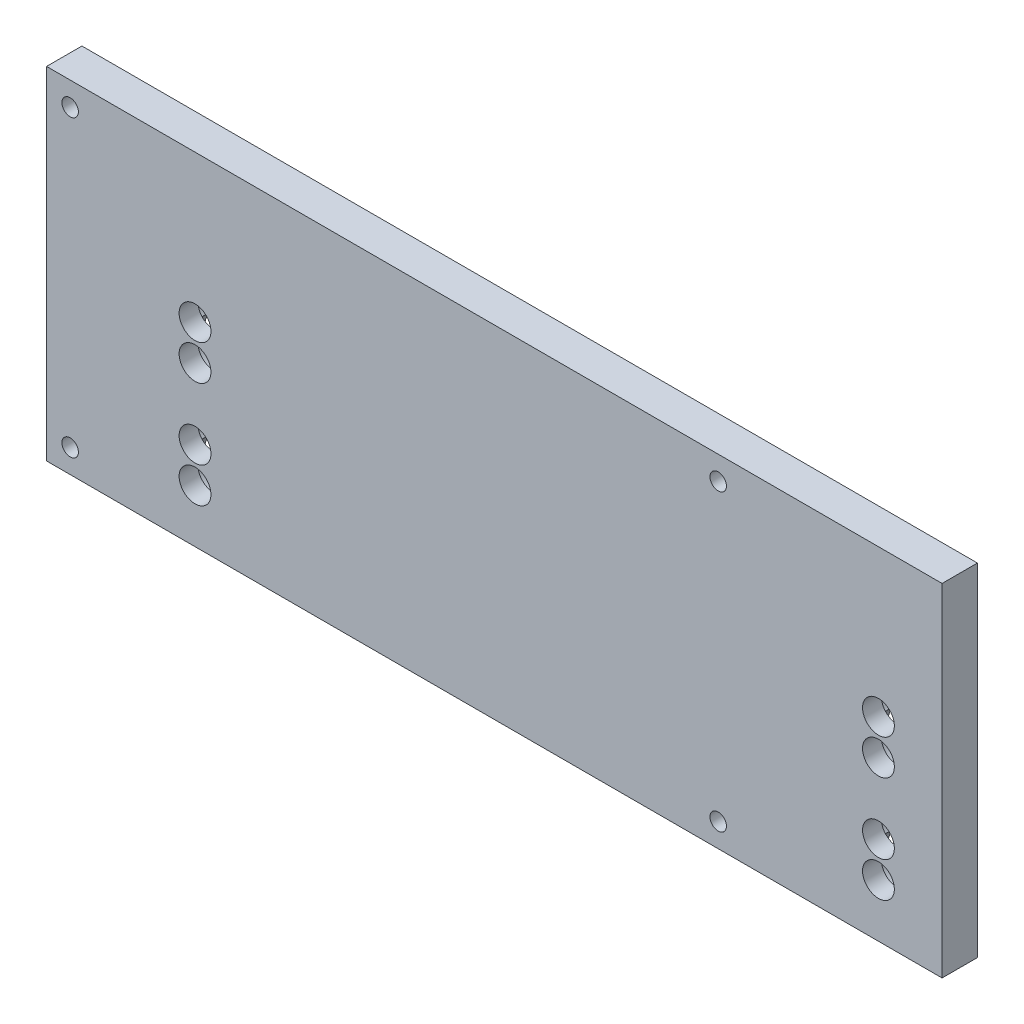
ISO-10303-21;
HEADER;
FILE_DESCRIPTION(('STEP AP214'),'2;1');
FILE_NAME('part.step','',(''),(''),'','','');
FILE_SCHEMA(('AUTOMOTIVE_DESIGN { 1 0 10303 214 1 1 1 1 }'));
ENDSEC;
DATA;
#1=APPLICATION_CONTEXT('core data for automotive mechanical design processes');
#2=APPLICATION_PROTOCOL_DEFINITION('international standard','automotive_design',2000,#1);
#3=PRODUCT_CONTEXT('',#1,'mechanical');
#4=PRODUCT('Part','Part','',(#3));
#5=PRODUCT_RELATED_PRODUCT_CATEGORY('part','',(#4));
#6=PRODUCT_DEFINITION_FORMATION('','',#4);
#7=PRODUCT_DEFINITION_CONTEXT('part definition',#1,'design');
#8=PRODUCT_DEFINITION('design','',#6,#7);
#9=PRODUCT_DEFINITION_SHAPE('','',#8);
#10=(LENGTH_UNIT() NAMED_UNIT(*) SI_UNIT(.MILLI.,.METRE.));
#11=(NAMED_UNIT(*) PLANE_ANGLE_UNIT() SI_UNIT($,.RADIAN.));
#12=(NAMED_UNIT(*) SI_UNIT($,.STERADIAN.) SOLID_ANGLE_UNIT());
#13=UNCERTAINTY_MEASURE_WITH_UNIT(LENGTH_MEASURE(1.E-05),#10,'distance_accuracy_value','');
#14=(GEOMETRIC_REPRESENTATION_CONTEXT(3) GLOBAL_UNCERTAINTY_ASSIGNED_CONTEXT((#13)) GLOBAL_UNIT_ASSIGNED_CONTEXT((#10,
#11,#12)) REPRESENTATION_CONTEXT('',''));
#15=CARTESIAN_POINT('',(0.,0.,0.));
#16=DIRECTION('',(0.,0.,1.));
#17=DIRECTION('',(1.,0.,0.));
#18=AXIS2_PLACEMENT_3D('',#15,#16,#17);
#19=CARTESIAN_POINT('',(69.75,-62.5,7.));
#20=DIRECTION('',(0.,0.,1.));
#21=DIRECTION('',(1.,0.,0.));
#22=AXIS2_PLACEMENT_3D('',#19,#20,#21);
#23=PLANE('',#22);
#24=CARTESIAN_POINT('',(63.,-62.5,7.));
#25=DIRECTION('',(0.,0.,-1.));
#26=DIRECTION('',(-1.,0.,0.));
#27=AXIS2_PLACEMENT_3D('',#24,#25,#26);
#28=CIRCLE('',#27,6.75000000000001);
#29=CARTESIAN_POINT('',(56.25,-62.5,7.));
#30=VERTEX_POINT('',#29);
#31=EDGE_CURVE('E132',#30,#30,#28,.T.);
#32=ORIENTED_EDGE('',*,*,#31,.F.);
#33=EDGE_LOOP('',(#32));
#34=FACE_BOUND('',#33,.T.);
#35=CARTESIAN_POINT('',(63.,-77.5,7.));
#36=DIRECTION('',(0.,0.,-1.));
#37=DIRECTION('',(-1.,0.,0.));
#38=AXIS2_PLACEMENT_3D('',#35,#36,#37);
#39=CIRCLE('',#38,11.);
#40=CARTESIAN_POINT('',(71.0467384697155,-70.,7.));
#41=VERTEX_POINT('',#40);
#42=CARTESIAN_POINT('',(54.9532615302845,-70.,7.));
#43=VERTEX_POINT('',#42);
#44=EDGE_CURVE('E47',#41,#43,#39,.T.);
#45=ORIENTED_EDGE('',*,*,#44,.T.);
#46=CARTESIAN_POINT('',(63.,-62.5,7.));
#47=DIRECTION('',(0.,0.,-1.));
#48=DIRECTION('',(-1.,0.,0.));
#49=AXIS2_PLACEMENT_3D('',#46,#47,#48);
#50=CIRCLE('',#49,11.);
#51=EDGE_CURVE('E128',#43,#41,#50,.T.);
#52=ORIENTED_EDGE('',*,*,#51,.T.);
#53=EDGE_LOOP('',(#45,#52));
#54=FACE_BOUND('',#53,.T.);
#55=CARTESIAN_POINT('',(63.,-77.5,7.));
#56=DIRECTION('',(0.,0.,-1.));
#57=DIRECTION('',(-1.,0.,0.));
#58=AXIS2_PLACEMENT_3D('',#55,#56,#57);
#59=CIRCLE('',#58,6.75000000000001);
#60=CARTESIAN_POINT('',(56.25,-77.5,7.));
#61=VERTEX_POINT('',#60);
#62=EDGE_CURVE('E129',#61,#61,#59,.T.);
#63=ORIENTED_EDGE('',*,*,#62,.F.);
#64=EDGE_LOOP('',(#63));
#65=FACE_BOUND('',#64,.T.);
#66=ADVANCED_FACE('F32',(#34,#54,#65),#23,.F.);
#67=CARTESIAN_POINT('',(69.75,-107.5,7.));
#68=DIRECTION('',(0.,0.,1.));
#69=DIRECTION('',(1.,0.,0.));
#70=AXIS2_PLACEMENT_3D('',#67,#68,#69);
#71=PLANE('',#70);
#72=CARTESIAN_POINT('',(63.,-107.5,7.));
#73=DIRECTION('',(0.,0.,-1.));
#74=DIRECTION('',(-1.,0.,0.));
#75=AXIS2_PLACEMENT_3D('',#72,#73,#74);
#76=CIRCLE('',#75,6.75000000000001);
#77=CARTESIAN_POINT('',(56.25,-107.5,7.));
#78=VERTEX_POINT('',#77);
#79=EDGE_CURVE('E150',#78,#78,#76,.T.);
#80=ORIENTED_EDGE('',*,*,#79,.F.);
#81=EDGE_LOOP('',(#80));
#82=FACE_BOUND('',#81,.T.);
#83=CARTESIAN_POINT('',(63.,-122.5,7.));
#84=DIRECTION('',(0.,0.,-1.));
#85=DIRECTION('',(-1.,0.,0.));
#86=AXIS2_PLACEMENT_3D('',#83,#84,#85);
#87=CIRCLE('',#86,11.);
#88=CARTESIAN_POINT('',(71.0467384697155,-115.,7.));
#89=VERTEX_POINT('',#88);
#90=CARTESIAN_POINT('',(54.9532615302845,-115.,7.));
#91=VERTEX_POINT('',#90);
#92=EDGE_CURVE('E55',#89,#91,#87,.T.);
#93=ORIENTED_EDGE('',*,*,#92,.T.);
#94=CARTESIAN_POINT('',(63.,-107.5,7.));
#95=DIRECTION('',(0.,0.,-1.));
#96=DIRECTION('',(-1.,0.,0.));
#97=AXIS2_PLACEMENT_3D('',#94,#95,#96);
#98=CIRCLE('',#97,11.);
#99=EDGE_CURVE('E147',#91,#89,#98,.T.);
#100=ORIENTED_EDGE('',*,*,#99,.T.);
#101=EDGE_LOOP('',(#93,#100));
#102=FACE_BOUND('',#101,.T.);
#103=CARTESIAN_POINT('',(63.,-122.5,7.));
#104=DIRECTION('',(0.,0.,-1.));
#105=DIRECTION('',(-1.,0.,0.));
#106=AXIS2_PLACEMENT_3D('',#103,#104,#105);
#107=CIRCLE('',#106,6.75000000000001);
#108=CARTESIAN_POINT('',(56.25,-122.5,7.));
#109=VERTEX_POINT('',#108);
#110=EDGE_CURVE('E263',#109,#109,#107,.T.);
#111=ORIENTED_EDGE('',*,*,#110,.F.);
#112=EDGE_LOOP('',(#111));
#113=FACE_BOUND('',#112,.T.);
#114=ADVANCED_FACE('F317',(#82,#102,#113),#71,.F.);
#115=CARTESIAN_POINT('',(359.75,-107.5,7.));
#116=DIRECTION('',(0.,0.,1.));
#117=DIRECTION('',(1.,0.,0.));
#118=AXIS2_PLACEMENT_3D('',#115,#116,#117);
#119=PLANE('',#118);
#120=CARTESIAN_POINT('',(353.,-107.5,7.));
#121=DIRECTION('',(0.,0.,-1.));
#122=DIRECTION('',(-1.,0.,0.));
#123=AXIS2_PLACEMENT_3D('',#120,#121,#122);
#124=CIRCLE('',#123,6.74999999999998);
#125=CARTESIAN_POINT('',(346.25,-107.5,7.));
#126=VERTEX_POINT('',#125);
#127=EDGE_CURVE('E162',#126,#126,#124,.T.);
#128=ORIENTED_EDGE('',*,*,#127,.F.);
#129=EDGE_LOOP('',(#128));
#130=FACE_BOUND('',#129,.T.);
#131=CARTESIAN_POINT('',(353.,-122.5,7.));
#132=DIRECTION('',(0.,0.,-1.));
#133=DIRECTION('',(-1.,0.,0.));
#134=AXIS2_PLACEMENT_3D('',#131,#132,#133);
#135=CIRCLE('',#134,11.);
#136=CARTESIAN_POINT('',(361.046738469716,-115.,7.));
#137=VERTEX_POINT('',#136);
#138=CARTESIAN_POINT('',(344.953261530284,-115.,7.));
#139=VERTEX_POINT('',#138);
#140=EDGE_CURVE('E276',#137,#139,#135,.T.);
#141=ORIENTED_EDGE('',*,*,#140,.T.);
#142=CARTESIAN_POINT('',(353.,-107.5,7.));
#143=DIRECTION('',(0.,0.,-1.));
#144=DIRECTION('',(-1.,0.,0.));
#145=AXIS2_PLACEMENT_3D('',#142,#143,#144);
#146=CIRCLE('',#145,11.);
#147=EDGE_CURVE('E159',#139,#137,#146,.T.);
#148=ORIENTED_EDGE('',*,*,#147,.T.);
#149=EDGE_LOOP('',(#141,#148));
#150=FACE_BOUND('',#149,.T.);
#151=CARTESIAN_POINT('',(353.,-122.5,7.));
#152=DIRECTION('',(0.,0.,-1.));
#153=DIRECTION('',(-1.,0.,0.));
#154=AXIS2_PLACEMENT_3D('',#151,#152,#153);
#155=CIRCLE('',#154,6.74999999999998);
#156=CARTESIAN_POINT('',(346.25,-122.5,7.));
#157=VERTEX_POINT('',#156);
#158=EDGE_CURVE('E279',#157,#157,#155,.T.);
#159=ORIENTED_EDGE('',*,*,#158,.F.);
#160=EDGE_LOOP('',(#159));
#161=FACE_BOUND('',#160,.T.);
#162=ADVANCED_FACE('F308',(#130,#150,#161),#119,.F.);
#163=CARTESIAN_POINT('',(359.75,-62.5,7.));
#164=DIRECTION('',(0.,0.,1.));
#165=DIRECTION('',(1.,0.,0.));
#166=AXIS2_PLACEMENT_3D('',#163,#164,#165);
#167=PLANE('',#166);
#168=CARTESIAN_POINT('',(353.,-62.5,7.));
#169=DIRECTION('',(0.,0.,-1.));
#170=DIRECTION('',(-1.,0.,0.));
#171=AXIS2_PLACEMENT_3D('',#168,#169,#170);
#172=CIRCLE('',#171,6.74999999999998);
#173=CARTESIAN_POINT('',(346.25,-62.5,7.));
#174=VERTEX_POINT('',#173);
#175=EDGE_CURVE('E174',#174,#174,#172,.T.);
#176=ORIENTED_EDGE('',*,*,#175,.F.);
#177=EDGE_LOOP('',(#176));
#178=FACE_BOUND('',#177,.T.);
#179=CARTESIAN_POINT('',(353.,-77.5,7.));
#180=DIRECTION('',(0.,0.,-1.));
#181=DIRECTION('',(-1.,0.,0.));
#182=AXIS2_PLACEMENT_3D('',#179,#180,#181);
#183=CIRCLE('',#182,11.);
#184=CARTESIAN_POINT('',(361.046738469716,-70.,7.));
#185=VERTEX_POINT('',#184);
#186=CARTESIAN_POINT('',(344.953261530284,-70.,7.));
#187=VERTEX_POINT('',#186);
#188=EDGE_CURVE('E287',#185,#187,#183,.T.);
#189=ORIENTED_EDGE('',*,*,#188,.T.);
#190=CARTESIAN_POINT('',(353.,-62.5,7.));
#191=DIRECTION('',(0.,0.,-1.));
#192=DIRECTION('',(-1.,0.,0.));
#193=AXIS2_PLACEMENT_3D('',#190,#191,#192);
#194=CIRCLE('',#193,11.);
#195=EDGE_CURVE('E171',#187,#185,#194,.T.);
#196=ORIENTED_EDGE('',*,*,#195,.T.);
#197=EDGE_LOOP('',(#189,#196));
#198=FACE_BOUND('',#197,.T.);
#199=CARTESIAN_POINT('',(353.,-77.5,7.));
#200=DIRECTION('',(0.,0.,-1.));
#201=DIRECTION('',(-1.,0.,0.));
#202=AXIS2_PLACEMENT_3D('',#199,#200,#201);
#203=CIRCLE('',#202,6.74999999999998);
#204=CARTESIAN_POINT('',(346.25,-77.5,7.));
#205=VERTEX_POINT('',#204);
#206=EDGE_CURVE('E290',#205,#205,#203,.T.);
#207=ORIENTED_EDGE('',*,*,#206,.F.);
#208=EDGE_LOOP('',(#207));
#209=FACE_BOUND('',#208,.T.);
#210=ADVANCED_FACE('F306',(#178,#198,#209),#167,.F.);
#211=CARTESIAN_POINT('',(0.,-145.,15.));
#212=DIRECTION('',(-1.,0.,0.));
#213=DIRECTION('',(0.,-1.,0.));
#214=AXIS2_PLACEMENT_3D('',#211,#212,#213);
#215=PLANE('',#214);
#216=DIRECTION('',(0.,1.,0.));
#217=VECTOR('',#216,1.);
#218=CARTESIAN_POINT('',(0.,-145.,0.));
#219=LINE('',#218,#217);
#220=CARTESIAN_POINT('',(0.,-145.,0.));
#221=VERTEX_POINT('',#220);
#222=CARTESIAN_POINT('',(0.,0.,0.));
#223=VERTEX_POINT('',#222);
#224=EDGE_CURVE('E204',#221,#223,#219,.T.);
#225=ORIENTED_EDGE('',*,*,#224,.F.);
#226=DIRECTION('',(0.,0.,-1.));
#227=VECTOR('',#226,1.);
#228=CARTESIAN_POINT('',(0.,-145.,15.));
#229=LINE('',#228,#227);
#230=CARTESIAN_POINT('',(0.,-145.,15.));
#231=VERTEX_POINT('',#230);
#232=EDGE_CURVE('E229',#231,#221,#229,.T.);
#233=ORIENTED_EDGE('',*,*,#232,.F.);
#234=DIRECTION('',(0.,1.,0.));
#235=VECTOR('',#234,1.);
#236=CARTESIAN_POINT('',(0.,-145.,15.));
#237=LINE('',#236,#235);
#238=CARTESIAN_POINT('',(0.,0.,15.));
#239=VERTEX_POINT('',#238);
#240=EDGE_CURVE('E205',#231,#239,#237,.T.);
#241=ORIENTED_EDGE('',*,*,#240,.T.);
#242=DIRECTION('',(0.,0.,-1.));
#243=VECTOR('',#242,1.);
#244=CARTESIAN_POINT('',(0.,0.,15.));
#245=LINE('',#244,#243);
#246=EDGE_CURVE('E218',#239,#223,#245,.T.);
#247=ORIENTED_EDGE('',*,*,#246,.T.);
#248=EDGE_LOOP('',(#225,#233,#241,#247));
#249=FACE_BOUND('',#248,.T.);
#250=ADVANCED_FACE('F34',(#249),#215,.T.);
#251=CARTESIAN_POINT('',(380.,-145.,15.));
#252=DIRECTION('',(0.,-1.,0.));
#253=DIRECTION('',(0.,0.,-1.));
#254=AXIS2_PLACEMENT_3D('',#251,#252,#253);
#255=PLANE('',#254);
#256=DIRECTION('',(-1.,0.,0.));
#257=VECTOR('',#256,1.);
#258=CARTESIAN_POINT('',(380.,-145.,0.));
#259=LINE('',#258,#257);
#260=CARTESIAN_POINT('',(380.,-145.,0.));
#261=VERTEX_POINT('',#260);
#262=EDGE_CURVE('E209',#261,#221,#259,.T.);
#263=ORIENTED_EDGE('',*,*,#262,.F.);
#264=DIRECTION('',(0.,0.,-1.));
#265=VECTOR('',#264,1.);
#266=CARTESIAN_POINT('',(380.,-145.,15.));
#267=LINE('',#266,#265);
#268=CARTESIAN_POINT('',(380.,-145.,15.));
#269=VERTEX_POINT('',#268);
#270=EDGE_CURVE('E232',#269,#261,#267,.T.);
#271=ORIENTED_EDGE('',*,*,#270,.F.);
#272=DIRECTION('',(-1.,0.,0.));
#273=VECTOR('',#272,1.);
#274=CARTESIAN_POINT('',(380.,-145.,15.));
#275=LINE('',#274,#273);
#276=EDGE_CURVE('E215',#269,#231,#275,.T.);
#277=ORIENTED_EDGE('',*,*,#276,.T.);
#278=ORIENTED_EDGE('',*,*,#232,.T.);
#279=EDGE_LOOP('',(#263,#271,#277,#278));
#280=FACE_BOUND('',#279,.T.);
#281=ADVANCED_FACE('F315',(#280),#255,.T.);
#282=CARTESIAN_POINT('',(380.,0.,15.));
#283=DIRECTION('',(1.,0.,0.));
#284=DIRECTION('',(0.,0.,-1.));
#285=AXIS2_PLACEMENT_3D('',#282,#283,#284);
#286=PLANE('',#285);
#287=DIRECTION('',(0.,-1.,0.));
#288=VECTOR('',#287,1.);
#289=CARTESIAN_POINT('',(380.,0.,0.));
#290=LINE('',#289,#288);
#291=CARTESIAN_POINT('',(380.,0.,0.));
#292=VERTEX_POINT('',#291);
#293=EDGE_CURVE('E224',#292,#261,#290,.T.);
#294=ORIENTED_EDGE('',*,*,#293,.F.);
#295=DIRECTION('',(0.,0.,-1.));
#296=VECTOR('',#295,1.);
#297=CARTESIAN_POINT('',(380.,0.,15.));
#298=LINE('',#297,#296);
#299=CARTESIAN_POINT('',(380.,0.,15.));
#300=VERTEX_POINT('',#299);
#301=EDGE_CURVE('E234',#300,#292,#298,.T.);
#302=ORIENTED_EDGE('',*,*,#301,.F.);
#303=DIRECTION('',(0.,-1.,0.));
#304=VECTOR('',#303,1.);
#305=CARTESIAN_POINT('',(380.,0.,15.));
#306=LINE('',#305,#304);
#307=EDGE_CURVE('E212',#300,#269,#306,.T.);
#308=ORIENTED_EDGE('',*,*,#307,.T.);
#309=ORIENTED_EDGE('',*,*,#270,.T.);
#310=EDGE_LOOP('',(#294,#302,#308,#309));
#311=FACE_BOUND('',#310,.T.);
#312=ADVANCED_FACE('F389',(#311),#286,.T.);
#313=CARTESIAN_POINT('',(0.,0.,15.));
#314=DIRECTION('',(0.,1.,0.));
#315=DIRECTION('',(0.,0.,1.));
#316=AXIS2_PLACEMENT_3D('',#313,#314,#315);
#317=PLANE('',#316);
#318=DIRECTION('',(1.,0.,0.));
#319=VECTOR('',#318,1.);
#320=CARTESIAN_POINT('',(0.,0.,0.));
#321=LINE('',#320,#319);
#322=EDGE_CURVE('E221',#223,#292,#321,.T.);
#323=ORIENTED_EDGE('',*,*,#322,.F.);
#324=ORIENTED_EDGE('',*,*,#246,.F.);
#325=DIRECTION('',(1.,0.,0.));
#326=VECTOR('',#325,1.);
#327=CARTESIAN_POINT('',(0.,0.,15.));
#328=LINE('',#327,#326);
#329=EDGE_CURVE('E208',#239,#300,#328,.T.);
#330=ORIENTED_EDGE('',*,*,#329,.T.);
#331=ORIENTED_EDGE('',*,*,#301,.T.);
#332=EDGE_LOOP('',(#323,#324,#330,#331));
#333=FACE_BOUND('',#332,.T.);
#334=ADVANCED_FACE('F385',(#333),#317,.T.);
#335=CARTESIAN_POINT('',(0.,0.,15.));
#336=DIRECTION('',(0.,0.,-1.));
#337=DIRECTION('',(-1.,0.,0.));
#338=AXIS2_PLACEMENT_3D('',#335,#336,#337);
#339=PLANE('',#338);
#340=CARTESIAN_POINT('',(63.,-77.5,15.));
#341=DIRECTION('',(0.,0.,-1.));
#342=DIRECTION('',(-1.,0.,0.));
#343=AXIS2_PLACEMENT_3D('',#340,#341,#342);
#344=CIRCLE('',#343,6.75000000000001);
#345=CARTESIAN_POINT('',(56.25,-77.5,15.));
#346=VERTEX_POINT('',#345);
#347=EDGE_CURVE('E261',#346,#346,#344,.T.);
#348=ORIENTED_EDGE('',*,*,#347,.T.);
#349=EDGE_LOOP('',(#348));
#350=FACE_BOUND('',#349,.T.);
#351=CARTESIAN_POINT('',(63.,-122.5,15.));
#352=DIRECTION('',(0.,0.,-1.));
#353=DIRECTION('',(-1.,0.,0.));
#354=AXIS2_PLACEMENT_3D('',#351,#352,#353);
#355=CIRCLE('',#354,6.75000000000001);
#356=CARTESIAN_POINT('',(56.25,-122.5,15.));
#357=VERTEX_POINT('',#356);
#358=EDGE_CURVE('E271',#357,#357,#355,.T.);
#359=ORIENTED_EDGE('',*,*,#358,.T.);
#360=EDGE_LOOP('',(#359));
#361=FACE_BOUND('',#360,.T.);
#362=CARTESIAN_POINT('',(353.,-122.5,15.));
#363=DIRECTION('',(0.,0.,-1.));
#364=DIRECTION('',(-1.,0.,0.));
#365=AXIS2_PLACEMENT_3D('',#362,#363,#364);
#366=CIRCLE('',#365,6.74999999999998);
#367=CARTESIAN_POINT('',(346.25,-122.5,15.));
#368=VERTEX_POINT('',#367);
#369=EDGE_CURVE('E282',#368,#368,#366,.T.);
#370=ORIENTED_EDGE('',*,*,#369,.T.);
#371=EDGE_LOOP('',(#370));
#372=FACE_BOUND('',#371,.T.);
#373=CARTESIAN_POINT('',(353.,-77.5,15.));
#374=DIRECTION('',(0.,0.,-1.));
#375=DIRECTION('',(-1.,0.,0.));
#376=AXIS2_PLACEMENT_3D('',#373,#374,#375);
#377=CIRCLE('',#376,6.74999999999998);
#378=CARTESIAN_POINT('',(346.25,-77.5,15.));
#379=VERTEX_POINT('',#378);
#380=EDGE_CURVE('E138',#379,#379,#377,.T.);
#381=ORIENTED_EDGE('',*,*,#380,.T.);
#382=EDGE_LOOP('',(#381));
#383=FACE_BOUND('',#382,.T.);
#384=CARTESIAN_POINT('',(63.,-62.5,15.));
#385=DIRECTION('',(0.,0.,-1.));
#386=DIRECTION('',(-1.,0.,0.));
#387=AXIS2_PLACEMENT_3D('',#384,#385,#386);
#388=CIRCLE('',#387,6.75000000000001);
#389=CARTESIAN_POINT('',(56.25,-62.5,15.));
#390=VERTEX_POINT('',#389);
#391=EDGE_CURVE('E136',#390,#390,#388,.T.);
#392=ORIENTED_EDGE('',*,*,#391,.T.);
#393=EDGE_LOOP('',(#392));
#394=FACE_BOUND('',#393,.T.);
#395=CARTESIAN_POINT('',(63.,-107.5,15.));
#396=DIRECTION('',(0.,0.,-1.));
#397=DIRECTION('',(-1.,0.,0.));
#398=AXIS2_PLACEMENT_3D('',#395,#396,#397);
#399=CIRCLE('',#398,6.75000000000001);
#400=CARTESIAN_POINT('',(56.25,-107.5,15.));
#401=VERTEX_POINT('',#400);
#402=EDGE_CURVE('E153',#401,#401,#399,.T.);
#403=ORIENTED_EDGE('',*,*,#402,.T.);
#404=EDGE_LOOP('',(#403));
#405=FACE_BOUND('',#404,.T.);
#406=CARTESIAN_POINT('',(353.,-107.5,15.));
#407=DIRECTION('',(0.,0.,-1.));
#408=DIRECTION('',(-1.,0.,0.));
#409=AXIS2_PLACEMENT_3D('',#406,#407,#408);
#410=CIRCLE('',#409,6.74999999999998);
#411=CARTESIAN_POINT('',(346.25,-107.5,15.));
#412=VERTEX_POINT('',#411);
#413=EDGE_CURVE('E165',#412,#412,#410,.T.);
#414=ORIENTED_EDGE('',*,*,#413,.T.);
#415=EDGE_LOOP('',(#414));
#416=FACE_BOUND('',#415,.T.);
#417=CARTESIAN_POINT('',(353.,-62.5,15.));
#418=DIRECTION('',(0.,0.,-1.));
#419=DIRECTION('',(-1.,0.,0.));
#420=AXIS2_PLACEMENT_3D('',#417,#418,#419);
#421=CIRCLE('',#420,6.74999999999998);
#422=CARTESIAN_POINT('',(346.25,-62.5,15.));
#423=VERTEX_POINT('',#422);
#424=EDGE_CURVE('E177',#423,#423,#421,.T.);
#425=ORIENTED_EDGE('',*,*,#424,.T.);
#426=EDGE_LOOP('',(#425));
#427=FACE_BOUND('',#426,.T.);
#428=CARTESIAN_POINT('',(9.99999999999998,-135.,15.));
#429=DIRECTION('',(0.,0.,-1.));
#430=DIRECTION('',(-1.,0.,0.));
#431=AXIS2_PLACEMENT_3D('',#428,#429,#430);
#432=CIRCLE('',#431,3.49999999999998);
#433=CARTESIAN_POINT('',(6.5,-135.,15.));
#434=VERTEX_POINT('',#433);
#435=EDGE_CURVE('E183',#434,#434,#432,.T.);
#436=ORIENTED_EDGE('',*,*,#435,.T.);
#437=EDGE_LOOP('',(#436));
#438=FACE_BOUND('',#437,.T.);
#439=CARTESIAN_POINT('',(10.,-9.99999999999998,15.));
#440=DIRECTION('',(0.,0.,-1.));
#441=DIRECTION('',(-1.,0.,0.));
#442=AXIS2_PLACEMENT_3D('',#439,#440,#441);
#443=CIRCLE('',#442,3.49999999999998);
#444=CARTESIAN_POINT('',(6.50000000000002,-9.99999999999998,15.));
#445=VERTEX_POINT('',#444);
#446=EDGE_CURVE('E189',#445,#445,#443,.T.);
#447=ORIENTED_EDGE('',*,*,#446,.T.);
#448=EDGE_LOOP('',(#447));
#449=FACE_BOUND('',#448,.T.);
#450=CARTESIAN_POINT('',(285.,-9.99999999999998,15.));
#451=DIRECTION('',(0.,0.,-1.));
#452=DIRECTION('',(-1.,0.,0.));
#453=AXIS2_PLACEMENT_3D('',#450,#451,#452);
#454=CIRCLE('',#453,3.5);
#455=CARTESIAN_POINT('',(281.5,-9.99999999999998,15.));
#456=VERTEX_POINT('',#455);
#457=EDGE_CURVE('E195',#456,#456,#454,.T.);
#458=ORIENTED_EDGE('',*,*,#457,.T.);
#459=EDGE_LOOP('',(#458));
#460=FACE_BOUND('',#459,.T.);
#461=CARTESIAN_POINT('',(285.,-135.,15.));
#462=DIRECTION('',(0.,0.,-1.));
#463=DIRECTION('',(-1.,0.,0.));
#464=AXIS2_PLACEMENT_3D('',#461,#462,#463);
#465=CIRCLE('',#464,3.5);
#466=CARTESIAN_POINT('',(281.5,-135.,15.));
#467=VERTEX_POINT('',#466);
#468=EDGE_CURVE('E201',#467,#467,#465,.T.);
#469=ORIENTED_EDGE('',*,*,#468,.T.);
#470=EDGE_LOOP('',(#469));
#471=FACE_BOUND('',#470,.T.);
#472=ORIENTED_EDGE('',*,*,#240,.F.);
#473=ORIENTED_EDGE('',*,*,#276,.F.);
#474=ORIENTED_EDGE('',*,*,#307,.F.);
#475=ORIENTED_EDGE('',*,*,#329,.F.);
#476=EDGE_LOOP('',(#472,#473,#474,#475));
#477=FACE_BOUND('',#476,.T.);
#478=ADVANCED_FACE('F295',(#350,#361,#372,#383,#394,#405,#416,#427,#438,#449,#460,#471,#477),
#339,.F.);
#479=CARTESIAN_POINT('',(0.,0.,0.));
#480=DIRECTION('',(0.,0.,-1.));
#481=DIRECTION('',(-1.,0.,0.));
#482=AXIS2_PLACEMENT_3D('',#479,#480,#481);
#483=PLANE('',#482);
#484=CARTESIAN_POINT('',(63.,-77.5,0.));
#485=DIRECTION('',(0.,0.,-1.));
#486=DIRECTION('',(-1.,0.,0.));
#487=AXIS2_PLACEMENT_3D('',#484,#485,#486);
#488=CIRCLE('',#487,11.);
#489=CARTESIAN_POINT('',(71.0467384697155,-70.,0.));
#490=VERTEX_POINT('',#489);
#491=CARTESIAN_POINT('',(54.9532615302845,-70.,0.));
#492=VERTEX_POINT('',#491);
#493=EDGE_CURVE('E120',#490,#492,#488,.T.);
#494=ORIENTED_EDGE('',*,*,#493,.F.);
#495=CARTESIAN_POINT('',(63.,-62.5,0.));
#496=DIRECTION('',(0.,0.,-1.));
#497=DIRECTION('',(-1.,0.,0.));
#498=AXIS2_PLACEMENT_3D('',#495,#496,#497);
#499=CIRCLE('',#498,11.);
#500=EDGE_CURVE('E133',#492,#490,#499,.T.);
#501=ORIENTED_EDGE('',*,*,#500,.F.);
#502=EDGE_LOOP('',(#494,#501));
#503=FACE_BOUND('',#502,.T.);
#504=CARTESIAN_POINT('',(63.,-122.5,0.));
#505=DIRECTION('',(0.,0.,-1.));
#506=DIRECTION('',(-1.,0.,0.));
#507=AXIS2_PLACEMENT_3D('',#504,#505,#506);
#508=CIRCLE('',#507,11.);
#509=CARTESIAN_POINT('',(71.0467384697155,-115.,0.));
#510=VERTEX_POINT('',#509);
#511=CARTESIAN_POINT('',(54.9532615302845,-115.,0.));
#512=VERTEX_POINT('',#511);
#513=EDGE_CURVE('E260',#510,#512,#508,.T.);
#514=ORIENTED_EDGE('',*,*,#513,.F.);
#515=CARTESIAN_POINT('',(63.,-107.5,0.));
#516=DIRECTION('',(0.,0.,-1.));
#517=DIRECTION('',(-1.,0.,0.));
#518=AXIS2_PLACEMENT_3D('',#515,#516,#517);
#519=CIRCLE('',#518,11.);
#520=EDGE_CURVE('E144',#512,#510,#519,.T.);
#521=ORIENTED_EDGE('',*,*,#520,.F.);
#522=EDGE_LOOP('',(#514,#521));
#523=FACE_BOUND('',#522,.T.);
#524=CARTESIAN_POINT('',(353.,-122.5,0.));
#525=DIRECTION('',(0.,0.,-1.));
#526=DIRECTION('',(-1.,0.,0.));
#527=AXIS2_PLACEMENT_3D('',#524,#525,#526);
#528=CIRCLE('',#527,11.);
#529=CARTESIAN_POINT('',(361.046738469716,-115.,0.));
#530=VERTEX_POINT('',#529);
#531=CARTESIAN_POINT('',(344.953261530284,-115.,0.));
#532=VERTEX_POINT('',#531);
#533=EDGE_CURVE('E274',#530,#532,#528,.T.);
#534=ORIENTED_EDGE('',*,*,#533,.F.);
#535=CARTESIAN_POINT('',(353.,-107.5,0.));
#536=DIRECTION('',(0.,0.,-1.));
#537=DIRECTION('',(-1.,0.,0.));
#538=AXIS2_PLACEMENT_3D('',#535,#536,#537);
#539=CIRCLE('',#538,11.);
#540=EDGE_CURVE('E156',#532,#530,#539,.T.);
#541=ORIENTED_EDGE('',*,*,#540,.F.);
#542=EDGE_LOOP('',(#534,#541));
#543=FACE_BOUND('',#542,.T.);
#544=CARTESIAN_POINT('',(353.,-77.5,0.));
#545=DIRECTION('',(0.,0.,-1.));
#546=DIRECTION('',(-1.,0.,0.));
#547=AXIS2_PLACEMENT_3D('',#544,#545,#546);
#548=CIRCLE('',#547,11.);
#549=CARTESIAN_POINT('',(361.046738469716,-70.,0.));
#550=VERTEX_POINT('',#549);
#551=CARTESIAN_POINT('',(344.953261530284,-70.,0.));
#552=VERTEX_POINT('',#551);
#553=EDGE_CURVE('E285',#550,#552,#548,.T.);
#554=ORIENTED_EDGE('',*,*,#553,.F.);
#555=CARTESIAN_POINT('',(353.,-62.5,0.));
#556=DIRECTION('',(0.,0.,-1.));
#557=DIRECTION('',(-1.,0.,0.));
#558=AXIS2_PLACEMENT_3D('',#555,#556,#557);
#559=CIRCLE('',#558,11.);
#560=EDGE_CURVE('E168',#552,#550,#559,.T.);
#561=ORIENTED_EDGE('',*,*,#560,.F.);
#562=EDGE_LOOP('',(#554,#561));
#563=FACE_BOUND('',#562,.T.);
#564=CARTESIAN_POINT('',(9.99999999999998,-135.,0.));
#565=DIRECTION('',(0.,0.,-1.));
#566=DIRECTION('',(-1.,0.,0.));
#567=AXIS2_PLACEMENT_3D('',#564,#565,#566);
#568=CIRCLE('',#567,3.49999999999998);
#569=CARTESIAN_POINT('',(6.5,-135.,0.));
#570=VERTEX_POINT('',#569);
#571=EDGE_CURVE('E180',#570,#570,#568,.T.);
#572=ORIENTED_EDGE('',*,*,#571,.F.);
#573=EDGE_LOOP('',(#572));
#574=FACE_BOUND('',#573,.T.);
#575=CARTESIAN_POINT('',(10.,-9.99999999999998,0.));
#576=DIRECTION('',(0.,0.,-1.));
#577=DIRECTION('',(-1.,0.,0.));
#578=AXIS2_PLACEMENT_3D('',#575,#576,#577);
#579=CIRCLE('',#578,3.49999999999998);
#580=CARTESIAN_POINT('',(6.50000000000002,-9.99999999999998,0.));
#581=VERTEX_POINT('',#580);
#582=EDGE_CURVE('E186',#581,#581,#579,.T.);
#583=ORIENTED_EDGE('',*,*,#582,.F.);
#584=EDGE_LOOP('',(#583));
#585=FACE_BOUND('',#584,.T.);
#586=CARTESIAN_POINT('',(285.,-9.99999999999998,0.));
#587=DIRECTION('',(0.,0.,-1.));
#588=DIRECTION('',(-1.,0.,0.));
#589=AXIS2_PLACEMENT_3D('',#586,#587,#588);
#590=CIRCLE('',#589,3.5);
#591=CARTESIAN_POINT('',(281.5,-9.99999999999998,0.));
#592=VERTEX_POINT('',#591);
#593=EDGE_CURVE('E192',#592,#592,#590,.T.);
#594=ORIENTED_EDGE('',*,*,#593,.F.);
#595=EDGE_LOOP('',(#594));
#596=FACE_BOUND('',#595,.T.);
#597=CARTESIAN_POINT('',(285.,-135.,0.));
#598=DIRECTION('',(0.,0.,-1.));
#599=DIRECTION('',(-1.,0.,0.));
#600=AXIS2_PLACEMENT_3D('',#597,#598,#599);
#601=CIRCLE('',#600,3.5);
#602=CARTESIAN_POINT('',(281.5,-135.,0.));
#603=VERTEX_POINT('',#602);
#604=EDGE_CURVE('E198',#603,#603,#601,.T.);
#605=ORIENTED_EDGE('',*,*,#604,.F.);
#606=EDGE_LOOP('',(#605));
#607=FACE_BOUND('',#606,.T.);
#608=ORIENTED_EDGE('',*,*,#224,.T.);
#609=ORIENTED_EDGE('',*,*,#322,.T.);
#610=ORIENTED_EDGE('',*,*,#293,.T.);
#611=ORIENTED_EDGE('',*,*,#262,.T.);
#612=EDGE_LOOP('',(#608,#609,#610,#611));
#613=FACE_BOUND('',#612,.T.);
#614=ADVANCED_FACE('F258',(#503,#523,#543,#563,#574,#585,#596,#607,#613),#483,.T.);
#615=CARTESIAN_POINT('',(285.,-135.,0.));
#616=DIRECTION('',(0.,0.,-1.));
#617=DIRECTION('',(-1.,0.,0.));
#618=AXIS2_PLACEMENT_3D('',#615,#616,#617);
#619=CYLINDRICAL_SURFACE('',#618,3.5);
#620=ORIENTED_EDGE('',*,*,#468,.F.);
#621=EDGE_LOOP('',(#620));
#622=FACE_BOUND('',#621,.T.);
#623=ORIENTED_EDGE('',*,*,#604,.T.);
#624=EDGE_LOOP('',(#623));
#625=FACE_BOUND('',#624,.T.);
#626=ADVANCED_FACE('F368',(#622,#625),#619,.F.);
#627=CARTESIAN_POINT('',(285.,-9.99999999999998,0.));
#628=DIRECTION('',(0.,0.,-1.));
#629=DIRECTION('',(-1.,0.,0.));
#630=AXIS2_PLACEMENT_3D('',#627,#628,#629);
#631=CYLINDRICAL_SURFACE('',#630,3.5);
#632=ORIENTED_EDGE('',*,*,#457,.F.);
#633=EDGE_LOOP('',(#632));
#634=FACE_BOUND('',#633,.T.);
#635=ORIENTED_EDGE('',*,*,#593,.T.);
#636=EDGE_LOOP('',(#635));
#637=FACE_BOUND('',#636,.T.);
#638=ADVANCED_FACE('F424',(#634,#637),#631,.F.);
#639=CARTESIAN_POINT('',(10.,-9.99999999999998,0.));
#640=DIRECTION('',(0.,0.,-1.));
#641=DIRECTION('',(-1.,0.,0.));
#642=AXIS2_PLACEMENT_3D('',#639,#640,#641);
#643=CYLINDRICAL_SURFACE('',#642,3.49999999999998);
#644=ORIENTED_EDGE('',*,*,#446,.F.);
#645=EDGE_LOOP('',(#644));
#646=FACE_BOUND('',#645,.T.);
#647=ORIENTED_EDGE('',*,*,#582,.T.);
#648=EDGE_LOOP('',(#647));
#649=FACE_BOUND('',#648,.T.);
#650=ADVANCED_FACE('F434',(#646,#649),#643,.F.);
#651=CARTESIAN_POINT('',(9.99999999999998,-135.,0.));
#652=DIRECTION('',(0.,0.,-1.));
#653=DIRECTION('',(-1.,0.,0.));
#654=AXIS2_PLACEMENT_3D('',#651,#652,#653);
#655=CYLINDRICAL_SURFACE('',#654,3.49999999999998);
#656=ORIENTED_EDGE('',*,*,#435,.F.);
#657=EDGE_LOOP('',(#656));
#658=FACE_BOUND('',#657,.T.);
#659=ORIENTED_EDGE('',*,*,#571,.T.);
#660=EDGE_LOOP('',(#659));
#661=FACE_BOUND('',#660,.T.);
#662=ADVANCED_FACE('F359',(#658,#661),#655,.F.);
#663=CARTESIAN_POINT('',(353.,-62.5,0.));
#664=DIRECTION('',(0.,0.,-1.));
#665=DIRECTION('',(-1.,0.,0.));
#666=AXIS2_PLACEMENT_3D('',#663,#664,#665);
#667=CYLINDRICAL_SURFACE('',#666,6.74999999999998);
#668=ORIENTED_EDGE('',*,*,#424,.F.);
#669=EDGE_LOOP('',(#668));
#670=FACE_BOUND('',#669,.T.);
#671=ORIENTED_EDGE('',*,*,#175,.T.);
#672=EDGE_LOOP('',(#671));
#673=FACE_BOUND('',#672,.T.);
#674=ADVANCED_FACE('F354',(#670,#673),#667,.F.);
#675=CARTESIAN_POINT('',(353.,-62.5,0.));
#676=DIRECTION('',(0.,0.,-1.));
#677=DIRECTION('',(-1.,0.,0.));
#678=AXIS2_PLACEMENT_3D('',#675,#676,#677);
#679=CYLINDRICAL_SURFACE('',#678,11.);
#680=ORIENTED_EDGE('',*,*,#195,.F.);
#681=DIRECTION('',(0.,0.,-1.));
#682=VECTOR('',#681,1.);
#683=CARTESIAN_POINT('',(344.953261530284,-70.,3.5));
#684=LINE('',#683,#682);
#685=EDGE_CURVE('E239',#187,#552,#684,.T.);
#686=ORIENTED_EDGE('',*,*,#685,.T.);
#687=ORIENTED_EDGE('',*,*,#560,.T.);
#688=DIRECTION('',(0.,0.,-1.));
#689=VECTOR('',#688,1.);
#690=CARTESIAN_POINT('',(361.046738469716,-70.,3.5));
#691=LINE('',#690,#689);
#692=EDGE_CURVE('E231',#550,#185,#691,.F.);
#693=ORIENTED_EDGE('',*,*,#692,.T.);
#694=EDGE_LOOP('',(#680,#686,#687,#693));
#695=FACE_BOUND('',#694,.T.);
#696=ADVANCED_FACE('F351',(#695),#679,.F.);
#697=CARTESIAN_POINT('',(353.,-107.5,0.));
#698=DIRECTION('',(0.,0.,-1.));
#699=DIRECTION('',(-1.,0.,0.));
#700=AXIS2_PLACEMENT_3D('',#697,#698,#699);
#701=CYLINDRICAL_SURFACE('',#700,6.74999999999998);
#702=ORIENTED_EDGE('',*,*,#413,.F.);
#703=EDGE_LOOP('',(#702));
#704=FACE_BOUND('',#703,.T.);
#705=ORIENTED_EDGE('',*,*,#127,.T.);
#706=EDGE_LOOP('',(#705));
#707=FACE_BOUND('',#706,.T.);
#708=ADVANCED_FACE('F347',(#704,#707),#701,.F.);
#709=CARTESIAN_POINT('',(353.,-107.5,0.));
#710=DIRECTION('',(0.,0.,-1.));
#711=DIRECTION('',(-1.,0.,0.));
#712=AXIS2_PLACEMENT_3D('',#709,#710,#711);
#713=CYLINDRICAL_SURFACE('',#712,11.);
#714=ORIENTED_EDGE('',*,*,#147,.F.);
#715=DIRECTION('',(0.,0.,-1.));
#716=VECTOR('',#715,1.);
#717=CARTESIAN_POINT('',(344.953261530284,-115.,3.5));
#718=LINE('',#717,#716);
#719=EDGE_CURVE('E245',#139,#532,#718,.T.);
#720=ORIENTED_EDGE('',*,*,#719,.T.);
#721=ORIENTED_EDGE('',*,*,#540,.T.);
#722=DIRECTION('',(0.,0.,-1.));
#723=VECTOR('',#722,1.);
#724=CARTESIAN_POINT('',(361.046738469716,-115.,3.5));
#725=LINE('',#724,#723);
#726=EDGE_CURVE('E242',#530,#137,#725,.F.);
#727=ORIENTED_EDGE('',*,*,#726,.T.);
#728=EDGE_LOOP('',(#714,#720,#721,#727));
#729=FACE_BOUND('',#728,.T.);
#730=ADVANCED_FACE('F344',(#729),#713,.F.);
#731=CARTESIAN_POINT('',(63.,-107.5,0.));
#732=DIRECTION('',(0.,0.,-1.));
#733=DIRECTION('',(-1.,0.,0.));
#734=AXIS2_PLACEMENT_3D('',#731,#732,#733);
#735=CYLINDRICAL_SURFACE('',#734,6.75000000000001);
#736=ORIENTED_EDGE('',*,*,#402,.F.);
#737=EDGE_LOOP('',(#736));
#738=FACE_BOUND('',#737,.T.);
#739=ORIENTED_EDGE('',*,*,#79,.T.);
#740=EDGE_LOOP('',(#739));
#741=FACE_BOUND('',#740,.T.);
#742=ADVANCED_FACE('F340',(#738,#741),#735,.F.);
#743=CARTESIAN_POINT('',(63.,-107.5,0.));
#744=DIRECTION('',(0.,0.,-1.));
#745=DIRECTION('',(-1.,0.,0.));
#746=AXIS2_PLACEMENT_3D('',#743,#744,#745);
#747=CYLINDRICAL_SURFACE('',#746,11.);
#748=ORIENTED_EDGE('',*,*,#99,.F.);
#749=DIRECTION('',(0.,0.,-1.));
#750=VECTOR('',#749,1.);
#751=CARTESIAN_POINT('',(54.9532615302845,-115.,3.5));
#752=LINE('',#751,#750);
#753=EDGE_CURVE('E250',#91,#512,#752,.T.);
#754=ORIENTED_EDGE('',*,*,#753,.T.);
#755=ORIENTED_EDGE('',*,*,#520,.T.);
#756=DIRECTION('',(0.,0.,-1.));
#757=VECTOR('',#756,1.);
#758=CARTESIAN_POINT('',(71.0467384697155,-115.,3.5));
#759=LINE('',#758,#757);
#760=EDGE_CURVE('E248',#510,#89,#759,.F.);
#761=ORIENTED_EDGE('',*,*,#760,.T.);
#762=EDGE_LOOP('',(#748,#754,#755,#761));
#763=FACE_BOUND('',#762,.T.);
#764=ADVANCED_FACE('F255',(#763),#747,.F.);
#765=CARTESIAN_POINT('',(63.,-62.5,0.));
#766=DIRECTION('',(0.,0.,-1.));
#767=DIRECTION('',(-1.,0.,0.));
#768=AXIS2_PLACEMENT_3D('',#765,#766,#767);
#769=CYLINDRICAL_SURFACE('',#768,6.75000000000001);
#770=ORIENTED_EDGE('',*,*,#391,.F.);
#771=EDGE_LOOP('',(#770));
#772=FACE_BOUND('',#771,.T.);
#773=ORIENTED_EDGE('',*,*,#31,.T.);
#774=EDGE_LOOP('',(#773));
#775=FACE_BOUND('',#774,.T.);
#776=ADVANCED_FACE('F335',(#772,#775),#769,.F.);
#777=CARTESIAN_POINT('',(63.,-62.5,0.));
#778=DIRECTION('',(0.,0.,-1.));
#779=DIRECTION('',(-1.,0.,0.));
#780=AXIS2_PLACEMENT_3D('',#777,#778,#779);
#781=CYLINDRICAL_SURFACE('',#780,11.);
#782=ORIENTED_EDGE('',*,*,#51,.F.);
#783=DIRECTION('',(0.,0.,-1.));
#784=VECTOR('',#783,1.);
#785=CARTESIAN_POINT('',(54.9532615302845,-70.,3.5));
#786=LINE('',#785,#784);
#787=EDGE_CURVE('E11',#43,#492,#786,.T.);
#788=ORIENTED_EDGE('',*,*,#787,.T.);
#789=ORIENTED_EDGE('',*,*,#500,.T.);
#790=DIRECTION('',(0.,0.,-1.));
#791=VECTOR('',#790,1.);
#792=CARTESIAN_POINT('',(71.0467384697155,-70.,3.5));
#793=LINE('',#792,#791);
#794=EDGE_CURVE('E40',#490,#41,#793,.F.);
#795=ORIENTED_EDGE('',*,*,#794,.T.);
#796=EDGE_LOOP('',(#782,#788,#789,#795));
#797=FACE_BOUND('',#796,.T.);
#798=ADVANCED_FACE('F131',(#797),#781,.F.);
#799=CARTESIAN_POINT('',(353.,-77.5,0.));
#800=DIRECTION('',(0.,0.,-1.));
#801=DIRECTION('',(-1.,0.,0.));
#802=AXIS2_PLACEMENT_3D('',#799,#800,#801);
#803=CYLINDRICAL_SURFACE('',#802,11.);
#804=ORIENTED_EDGE('',*,*,#188,.F.);
#805=ORIENTED_EDGE('',*,*,#692,.F.);
#806=ORIENTED_EDGE('',*,*,#553,.T.);
#807=ORIENTED_EDGE('',*,*,#685,.F.);
#808=EDGE_LOOP('',(#804,#805,#806,#807));
#809=FACE_BOUND('',#808,.T.);
#810=ADVANCED_FACE('F302',(#809),#803,.F.);
#811=CARTESIAN_POINT('',(353.,-77.5,0.));
#812=DIRECTION('',(0.,0.,-1.));
#813=DIRECTION('',(-1.,0.,0.));
#814=AXIS2_PLACEMENT_3D('',#811,#812,#813);
#815=CYLINDRICAL_SURFACE('',#814,6.74999999999998);
#816=ORIENTED_EDGE('',*,*,#380,.F.);
#817=EDGE_LOOP('',(#816));
#818=FACE_BOUND('',#817,.T.);
#819=ORIENTED_EDGE('',*,*,#206,.T.);
#820=EDGE_LOOP('',(#819));
#821=FACE_BOUND('',#820,.T.);
#822=ADVANCED_FACE('F298',(#818,#821),#815,.F.);
#823=CARTESIAN_POINT('',(353.,-122.5,0.));
#824=DIRECTION('',(0.,0.,-1.));
#825=DIRECTION('',(-1.,0.,0.));
#826=AXIS2_PLACEMENT_3D('',#823,#824,#825);
#827=CYLINDRICAL_SURFACE('',#826,11.);
#828=ORIENTED_EDGE('',*,*,#140,.F.);
#829=ORIENTED_EDGE('',*,*,#726,.F.);
#830=ORIENTED_EDGE('',*,*,#533,.T.);
#831=ORIENTED_EDGE('',*,*,#719,.F.);
#832=EDGE_LOOP('',(#828,#829,#830,#831));
#833=FACE_BOUND('',#832,.T.);
#834=ADVANCED_FACE('F301',(#833),#827,.F.);
#835=CARTESIAN_POINT('',(353.,-122.5,0.));
#836=DIRECTION('',(0.,0.,-1.));
#837=DIRECTION('',(-1.,0.,0.));
#838=AXIS2_PLACEMENT_3D('',#835,#836,#837);
#839=CYLINDRICAL_SURFACE('',#838,6.74999999999998);
#840=ORIENTED_EDGE('',*,*,#369,.F.);
#841=EDGE_LOOP('',(#840));
#842=FACE_BOUND('',#841,.T.);
#843=ORIENTED_EDGE('',*,*,#158,.T.);
#844=EDGE_LOOP('',(#843));
#845=FACE_BOUND('',#844,.T.);
#846=ADVANCED_FACE('F554',(#842,#845),#839,.F.);
#847=CARTESIAN_POINT('',(63.,-122.5,0.));
#848=DIRECTION('',(0.,0.,-1.));
#849=DIRECTION('',(-1.,0.,0.));
#850=AXIS2_PLACEMENT_3D('',#847,#848,#849);
#851=CYLINDRICAL_SURFACE('',#850,11.);
#852=ORIENTED_EDGE('',*,*,#92,.F.);
#853=ORIENTED_EDGE('',*,*,#760,.F.);
#854=ORIENTED_EDGE('',*,*,#513,.T.);
#855=ORIENTED_EDGE('',*,*,#753,.F.);
#856=EDGE_LOOP('',(#852,#853,#854,#855));
#857=FACE_BOUND('',#856,.T.);
#858=ADVANCED_FACE('F564',(#857),#851,.F.);
#859=CARTESIAN_POINT('',(63.,-122.5,0.));
#860=DIRECTION('',(0.,0.,-1.));
#861=DIRECTION('',(-1.,0.,0.));
#862=AXIS2_PLACEMENT_3D('',#859,#860,#861);
#863=CYLINDRICAL_SURFACE('',#862,6.75000000000001);
#864=ORIENTED_EDGE('',*,*,#358,.F.);
#865=EDGE_LOOP('',(#864));
#866=FACE_BOUND('',#865,.T.);
#867=ORIENTED_EDGE('',*,*,#110,.T.);
#868=EDGE_LOOP('',(#867));
#869=FACE_BOUND('',#868,.T.);
#870=ADVANCED_FACE('F574',(#866,#869),#863,.F.);
#871=CARTESIAN_POINT('',(63.,-77.5,0.));
#872=DIRECTION('',(0.,0.,-1.));
#873=DIRECTION('',(-1.,0.,0.));
#874=AXIS2_PLACEMENT_3D('',#871,#872,#873);
#875=CYLINDRICAL_SURFACE('',#874,11.);
#876=ORIENTED_EDGE('',*,*,#44,.F.);
#877=ORIENTED_EDGE('',*,*,#794,.F.);
#878=ORIENTED_EDGE('',*,*,#493,.T.);
#879=ORIENTED_EDGE('',*,*,#787,.F.);
#880=EDGE_LOOP('',(#876,#877,#878,#879));
#881=FACE_BOUND('',#880,.T.);
#882=ADVANCED_FACE('F118',(#881),#875,.F.);
#883=CARTESIAN_POINT('',(63.,-77.5,0.));
#884=DIRECTION('',(0.,0.,-1.));
#885=DIRECTION('',(-1.,0.,0.));
#886=AXIS2_PLACEMENT_3D('',#883,#884,#885);
#887=CYLINDRICAL_SURFACE('',#886,6.75000000000001);
#888=ORIENTED_EDGE('',*,*,#347,.F.);
#889=EDGE_LOOP('',(#888));
#890=FACE_BOUND('',#889,.T.);
#891=ORIENTED_EDGE('',*,*,#62,.T.);
#892=EDGE_LOOP('',(#891));
#893=FACE_BOUND('',#892,.T.);
#894=ADVANCED_FACE('F592',(#890,#893),#887,.F.);
#895=CLOSED_SHELL('',(#66,#114,#162,#210,#250,#281,#312,#334,#478,#614,#626,#638,#650,#662,#674,
#696,#708,#730,#742,#764,#776,#798,#810,#822,#834,#846,#858,#870,#882,#894));
#896=MANIFOLD_SOLID_BREP('B2',#895);
#897=ADVANCED_BREP_SHAPE_REPRESENTATION('',(#18,#896),#14);
#898=SHAPE_DEFINITION_REPRESENTATION(#9,#897);
ENDSEC;
END-ISO-10303-21;
